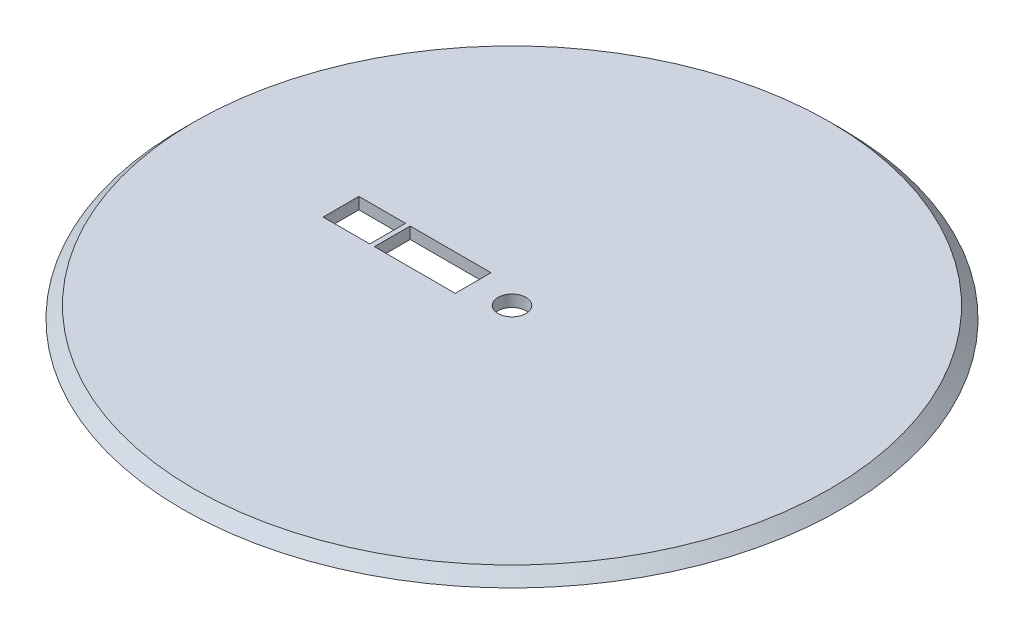
ISO-10303-21;
HEADER;
FILE_DESCRIPTION(('STEP AP214'),'2;1');
FILE_NAME('part.step','',(''),(''),'','','');
FILE_SCHEMA(('AUTOMOTIVE_DESIGN { 1 0 10303 214 1 1 1 1 }'));
ENDSEC;
DATA;
#1=APPLICATION_CONTEXT('core data for automotive mechanical design processes');
#2=APPLICATION_PROTOCOL_DEFINITION('international standard','automotive_design',2000,#1);
#3=PRODUCT_CONTEXT('',#1,'mechanical');
#4=PRODUCT('Part','Part','',(#3));
#5=PRODUCT_RELATED_PRODUCT_CATEGORY('part','',(#4));
#6=PRODUCT_DEFINITION_FORMATION('','',#4);
#7=PRODUCT_DEFINITION_CONTEXT('part definition',#1,'design');
#8=PRODUCT_DEFINITION('design','',#6,#7);
#9=PRODUCT_DEFINITION_SHAPE('','',#8);
#10=(LENGTH_UNIT() NAMED_UNIT(*) SI_UNIT(.MILLI.,.METRE.));
#11=(NAMED_UNIT(*) PLANE_ANGLE_UNIT() SI_UNIT($,.RADIAN.));
#12=(NAMED_UNIT(*) SI_UNIT($,.STERADIAN.) SOLID_ANGLE_UNIT());
#13=UNCERTAINTY_MEASURE_WITH_UNIT(LENGTH_MEASURE(1.E-05),#10,'distance_accuracy_value','');
#14=(GEOMETRIC_REPRESENTATION_CONTEXT(3) GLOBAL_UNCERTAINTY_ASSIGNED_CONTEXT((#13)) GLOBAL_UNIT_ASSIGNED_CONTEXT((#10,
#11,#12)) REPRESENTATION_CONTEXT('',''));
#15=CARTESIAN_POINT('',(0.,0.,0.));
#16=DIRECTION('',(0.,0.,1.));
#17=DIRECTION('',(1.,0.,0.));
#18=AXIS2_PLACEMENT_3D('',#15,#16,#17);
#19=CARTESIAN_POINT('',(-21.45,-0.375,0.));
#20=DIRECTION('',(0.,1.,0.));
#21=DIRECTION('',(0.,0.,1.));
#22=AXIS2_PLACEMENT_3D('',#19,#20,#21);
#23=PLANE('',#22);
#24=CARTESIAN_POINT('',(0.,-0.375,0.));
#25=DIRECTION('',(0.,1.,0.));
#26=DIRECTION('',(0.,0.,1.));
#27=AXIS2_PLACEMENT_3D('',#24,#25,#26);
#28=CIRCLE('',#27,21.2);
#29=CARTESIAN_POINT('',(0.,-0.375,21.2));
#30=VERTEX_POINT('',#29);
#31=EDGE_CURVE('E44',#30,#30,#28,.F.);
#32=ORIENTED_EDGE('',*,*,#31,.T.);
#33=EDGE_LOOP('',(#32));
#34=FACE_BOUND('',#33,.T.);
#35=CARTESIAN_POINT('',(0.,-0.375,0.));
#36=DIRECTION('',(0.,1.,0.));
#37=DIRECTION('',(0.,0.,1.));
#38=AXIS2_PLACEMENT_3D('',#35,#36,#37);
#39=CIRCLE('',#38,0.9);
#40=CARTESIAN_POINT('',(0.,-0.375,0.9));
#41=VERTEX_POINT('',#40);
#42=EDGE_CURVE('E220',#41,#41,#39,.T.);
#43=ORIENTED_EDGE('',*,*,#42,.T.);
#44=EDGE_LOOP('',(#43));
#45=FACE_BOUND('',#44,.T.);
#46=DIRECTION('',(1.,0.,0.));
#47=VECTOR('',#46,1.);
#48=CARTESIAN_POINT('',(-21.45,-0.375,1.15000000000001));
#49=LINE('',#48,#47);
#50=CARTESIAN_POINT('',(-7.7,-0.375,1.15));
#51=VERTEX_POINT('',#50);
#52=CARTESIAN_POINT('',(-2.5,-0.375,1.15));
#53=VERTEX_POINT('',#52);
#54=EDGE_CURVE('E214',#51,#53,#49,.T.);
#55=ORIENTED_EDGE('',*,*,#54,.T.);
#56=DIRECTION('',(0.,0.,-1.));
#57=VECTOR('',#56,1.);
#58=CARTESIAN_POINT('',(-2.5,-0.375,0.));
#59=LINE('',#58,#57);
#60=CARTESIAN_POINT('',(-2.5,-0.375,-1.15));
#61=VERTEX_POINT('',#60);
#62=EDGE_CURVE('E217',#53,#61,#59,.T.);
#63=ORIENTED_EDGE('',*,*,#62,.T.);
#64=DIRECTION('',(-1.,0.,0.));
#65=VECTOR('',#64,1.);
#66=CARTESIAN_POINT('',(-21.45,-0.375,-1.15));
#67=LINE('',#66,#65);
#68=CARTESIAN_POINT('',(-7.7,-0.375,-1.15));
#69=VERTEX_POINT('',#68);
#70=EDGE_CURVE('E211',#61,#69,#67,.T.);
#71=ORIENTED_EDGE('',*,*,#70,.T.);
#72=DIRECTION('',(0.,0.,1.));
#73=VECTOR('',#72,1.);
#74=CARTESIAN_POINT('',(-7.7,-0.375,0.));
#75=LINE('',#74,#73);
#76=EDGE_CURVE('E154',#69,#51,#75,.T.);
#77=ORIENTED_EDGE('',*,*,#76,.T.);
#78=EDGE_LOOP('',(#55,#63,#71,#77));
#79=FACE_BOUND('',#78,.T.);
#80=DIRECTION('',(1.,0.,0.));
#81=VECTOR('',#80,1.);
#82=CARTESIAN_POINT('',(-21.45,-0.375,1.15000000000001));
#83=LINE('',#82,#81);
#84=CARTESIAN_POINT('',(-11.,-0.375,1.15));
#85=VERTEX_POINT('',#84);
#86=CARTESIAN_POINT('',(-8.,-0.375,1.15));
#87=VERTEX_POINT('',#86);
#88=EDGE_CURVE('E205',#85,#87,#83,.T.);
#89=ORIENTED_EDGE('',*,*,#88,.T.);
#90=DIRECTION('',(0.,0.,-1.));
#91=VECTOR('',#90,1.);
#92=CARTESIAN_POINT('',(-8.,-0.375,0.));
#93=LINE('',#92,#91);
#94=CARTESIAN_POINT('',(-8.,-0.375,-1.15));
#95=VERTEX_POINT('',#94);
#96=EDGE_CURVE('E208',#87,#95,#93,.T.);
#97=ORIENTED_EDGE('',*,*,#96,.T.);
#98=DIRECTION('',(-1.,0.,0.));
#99=VECTOR('',#98,1.);
#100=CARTESIAN_POINT('',(-21.45,-0.375,-1.15));
#101=LINE('',#100,#99);
#102=CARTESIAN_POINT('',(-11.,-0.375,-1.15));
#103=VERTEX_POINT('',#102);
#104=EDGE_CURVE('E194',#95,#103,#101,.T.);
#105=ORIENTED_EDGE('',*,*,#104,.T.);
#106=DIRECTION('',(0.,0.,1.));
#107=VECTOR('',#106,1.);
#108=CARTESIAN_POINT('',(-11.,-0.375,0.));
#109=LINE('',#108,#107);
#110=EDGE_CURVE('E202',#103,#85,#109,.T.);
#111=ORIENTED_EDGE('',*,*,#110,.T.);
#112=EDGE_LOOP('',(#89,#97,#105,#111));
#113=FACE_BOUND('',#112,.T.);
#114=DIRECTION('',(-1.,0.,0.));
#115=VECTOR('',#114,1.);
#116=CARTESIAN_POINT('',(-2.1,-0.375,15.6));
#117=LINE('',#116,#115);
#118=CARTESIAN_POINT('',(2.1,-0.375,15.6));
#119=VERTEX_POINT('',#118);
#120=CARTESIAN_POINT('',(-2.1,-0.375,15.6));
#121=VERTEX_POINT('',#120);
#122=EDGE_CURVE('E256',#119,#121,#117,.T.);
#123=ORIENTED_EDGE('',*,*,#122,.F.);
#124=DIRECTION('',(0.,0.,1.));
#125=VECTOR('',#124,1.);
#126=CARTESIAN_POINT('',(2.1,-0.375,14.4));
#127=LINE('',#126,#125);
#128=CARTESIAN_POINT('',(2.1,-0.375,14.4));
#129=VERTEX_POINT('',#128);
#130=EDGE_CURVE('E261',#129,#119,#127,.T.);
#131=ORIENTED_EDGE('',*,*,#130,.F.);
#132=DIRECTION('',(1.,0.,0.));
#133=VECTOR('',#132,1.);
#134=CARTESIAN_POINT('',(-2.1,-0.375,14.4));
#135=LINE('',#134,#133);
#136=CARTESIAN_POINT('',(-2.1,-0.375,14.4));
#137=VERTEX_POINT('',#136);
#138=EDGE_CURVE('E273',#137,#129,#135,.T.);
#139=ORIENTED_EDGE('',*,*,#138,.F.);
#140=DIRECTION('',(0.,0.,-1.));
#141=VECTOR('',#140,1.);
#142=CARTESIAN_POINT('',(-2.1,-0.375,14.4));
#143=LINE('',#142,#141);
#144=EDGE_CURVE('E270',#121,#137,#143,.T.);
#145=ORIENTED_EDGE('',*,*,#144,.F.);
#146=EDGE_LOOP('',(#123,#131,#139,#145));
#147=FACE_BOUND('',#146,.T.);
#148=DIRECTION('',(-1.,0.,0.));
#149=VECTOR('',#148,1.);
#150=CARTESIAN_POINT('',(-2.1,-0.375,-14.4));
#151=LINE('',#150,#149);
#152=CARTESIAN_POINT('',(2.1,-0.375,-14.4));
#153=VERTEX_POINT('',#152);
#154=CARTESIAN_POINT('',(-2.09999999999999,-0.375,-14.4));
#155=VERTEX_POINT('',#154);
#156=EDGE_CURVE('E223',#153,#155,#151,.T.);
#157=ORIENTED_EDGE('',*,*,#156,.F.);
#158=DIRECTION('',(0.,0.,1.));
#159=VECTOR('',#158,1.);
#160=CARTESIAN_POINT('',(2.1,-0.375,-14.4));
#161=LINE('',#160,#159);
#162=CARTESIAN_POINT('',(2.1,-0.375,-15.6));
#163=VERTEX_POINT('',#162);
#164=EDGE_CURVE('E228',#163,#153,#161,.T.);
#165=ORIENTED_EDGE('',*,*,#164,.F.);
#166=DIRECTION('',(1.,0.,0.));
#167=VECTOR('',#166,1.);
#168=CARTESIAN_POINT('',(-2.1,-0.375,-15.6));
#169=LINE('',#168,#167);
#170=CARTESIAN_POINT('',(-2.1,-0.375,-15.6));
#171=VERTEX_POINT('',#170);
#172=EDGE_CURVE('E240',#171,#163,#169,.T.);
#173=ORIENTED_EDGE('',*,*,#172,.F.);
#174=DIRECTION('',(0.,0.,-1.));
#175=VECTOR('',#174,1.);
#176=CARTESIAN_POINT('',(-2.1,-0.375,-14.4));
#177=LINE('',#176,#175);
#178=EDGE_CURVE('E237',#155,#171,#177,.T.);
#179=ORIENTED_EDGE('',*,*,#178,.F.);
#180=EDGE_LOOP('',(#157,#165,#173,#179));
#181=FACE_BOUND('',#180,.T.);
#182=ADVANCED_FACE('F36',(#34,#45,#79,#113,#147,#181),#23,.F.);
#183=CARTESIAN_POINT('',(-21.45,0.375,0.));
#184=DIRECTION('',(0.,-1.,0.));
#185=DIRECTION('',(0.,0.,-1.));
#186=AXIS2_PLACEMENT_3D('',#183,#184,#185);
#187=PLANE('',#186);
#188=CARTESIAN_POINT('',(0.,0.375,0.));
#189=DIRECTION('',(0.,-1.,0.));
#190=DIRECTION('',(0.,0.,-1.));
#191=AXIS2_PLACEMENT_3D('',#188,#189,#190);
#192=CIRCLE('',#191,20.45);
#193=CARTESIAN_POINT('',(0.,0.375,-20.45));
#194=VERTEX_POINT('',#193);
#195=EDGE_CURVE('E12',#194,#194,#192,.F.);
#196=ORIENTED_EDGE('',*,*,#195,.T.);
#197=EDGE_LOOP('',(#196));
#198=FACE_BOUND('',#197,.T.);
#199=CARTESIAN_POINT('',(0.,0.375,0.));
#200=DIRECTION('',(0.,1.,0.));
#201=DIRECTION('',(0.,0.,1.));
#202=AXIS2_PLACEMENT_3D('',#199,#200,#201);
#203=CIRCLE('',#202,0.9);
#204=CARTESIAN_POINT('',(0.,0.375,0.9));
#205=VERTEX_POINT('',#204);
#206=EDGE_CURVE('E178',#205,#205,#203,.T.);
#207=ORIENTED_EDGE('',*,*,#206,.F.);
#208=EDGE_LOOP('',(#207));
#209=FACE_BOUND('',#208,.T.);
#210=DIRECTION('',(-1.,0.,0.));
#211=VECTOR('',#210,1.);
#212=CARTESIAN_POINT('',(-7.7,0.375,-1.15));
#213=LINE('',#212,#211);
#214=CARTESIAN_POINT('',(-2.5,0.375,-1.15));
#215=VERTEX_POINT('',#214);
#216=CARTESIAN_POINT('',(-7.7,0.375,-1.15));
#217=VERTEX_POINT('',#216);
#218=EDGE_CURVE('E161',#215,#217,#213,.T.);
#219=ORIENTED_EDGE('',*,*,#218,.F.);
#220=DIRECTION('',(0.,0.,-1.));
#221=VECTOR('',#220,1.);
#222=CARTESIAN_POINT('',(-2.5,0.375,-1.15));
#223=LINE('',#222,#221);
#224=CARTESIAN_POINT('',(-2.5,0.375,1.15));
#225=VERTEX_POINT('',#224);
#226=EDGE_CURVE('E166',#225,#215,#223,.T.);
#227=ORIENTED_EDGE('',*,*,#226,.F.);
#228=DIRECTION('',(1.,0.,0.));
#229=VECTOR('',#228,1.);
#230=CARTESIAN_POINT('',(-7.7,0.375,1.15));
#231=LINE('',#230,#229);
#232=CARTESIAN_POINT('',(-7.7,0.375,1.15));
#233=VERTEX_POINT('',#232);
#234=EDGE_CURVE('E171',#233,#225,#231,.T.);
#235=ORIENTED_EDGE('',*,*,#234,.F.);
#236=DIRECTION('',(0.,0.,1.));
#237=VECTOR('',#236,1.);
#238=CARTESIAN_POINT('',(-7.7,0.375,-1.15));
#239=LINE('',#238,#237);
#240=EDGE_CURVE('E151',#217,#233,#239,.T.);
#241=ORIENTED_EDGE('',*,*,#240,.F.);
#242=EDGE_LOOP('',(#219,#227,#235,#241));
#243=FACE_BOUND('',#242,.T.);
#244=DIRECTION('',(-1.,0.,0.));
#245=VECTOR('',#244,1.);
#246=CARTESIAN_POINT('',(-11.,0.375,-1.15));
#247=LINE('',#246,#245);
#248=CARTESIAN_POINT('',(-8.,0.375,-1.15));
#249=VERTEX_POINT('',#248);
#250=CARTESIAN_POINT('',(-11.,0.375,-1.15));
#251=VERTEX_POINT('',#250);
#252=EDGE_CURVE('E183',#249,#251,#247,.T.);
#253=ORIENTED_EDGE('',*,*,#252,.F.);
#254=DIRECTION('',(0.,0.,-1.));
#255=VECTOR('',#254,1.);
#256=CARTESIAN_POINT('',(-8.,0.375,-1.15));
#257=LINE('',#256,#255);
#258=CARTESIAN_POINT('',(-8.,0.375,1.15));
#259=VERTEX_POINT('',#258);
#260=EDGE_CURVE('E181',#259,#249,#257,.T.);
#261=ORIENTED_EDGE('',*,*,#260,.F.);
#262=DIRECTION('',(1.,0.,0.));
#263=VECTOR('',#262,1.);
#264=CARTESIAN_POINT('',(-11.,0.375,1.15));
#265=LINE('',#264,#263);
#266=CARTESIAN_POINT('',(-11.,0.375,1.15));
#267=VERTEX_POINT('',#266);
#268=EDGE_CURVE('E188',#267,#259,#265,.T.);
#269=ORIENTED_EDGE('',*,*,#268,.F.);
#270=DIRECTION('',(0.,0.,1.));
#271=VECTOR('',#270,1.);
#272=CARTESIAN_POINT('',(-11.,0.375,-1.15));
#273=LINE('',#272,#271);
#274=EDGE_CURVE('E185',#251,#267,#273,.T.);
#275=ORIENTED_EDGE('',*,*,#274,.F.);
#276=EDGE_LOOP('',(#253,#261,#269,#275));
#277=FACE_BOUND('',#276,.T.);
#278=ADVANCED_FACE('F168',(#198,#209,#243,#277),#187,.F.);
#279=CARTESIAN_POINT('',(-2.1,-2.175,15.6));
#280=DIRECTION('',(0.,0.,-1.));
#281=DIRECTION('',(-1.,0.,0.));
#282=AXIS2_PLACEMENT_3D('',#279,#280,#281);
#283=PLANE('',#282);
#284=ORIENTED_EDGE('',*,*,#122,.T.);
#285=DIRECTION('',(0.,1.,0.));
#286=VECTOR('',#285,1.);
#287=CARTESIAN_POINT('',(-2.1,-2.175,15.6));
#288=LINE('',#287,#286);
#289=CARTESIAN_POINT('',(-2.1,-2.175,15.6));
#290=VERTEX_POINT('',#289);
#291=EDGE_CURVE('E286',#290,#121,#288,.T.);
#292=ORIENTED_EDGE('',*,*,#291,.F.);
#293=DIRECTION('',(-1.,0.,0.));
#294=VECTOR('',#293,1.);
#295=CARTESIAN_POINT('',(-2.1,-2.175,15.6));
#296=LINE('',#295,#294);
#297=CARTESIAN_POINT('',(2.1,-2.175,15.6));
#298=VERTEX_POINT('',#297);
#299=EDGE_CURVE('E257',#298,#290,#296,.T.);
#300=ORIENTED_EDGE('',*,*,#299,.F.);
#301=DIRECTION('',(0.,1.,0.));
#302=VECTOR('',#301,1.);
#303=CARTESIAN_POINT('',(2.1,-2.175,15.6));
#304=LINE('',#303,#302);
#305=EDGE_CURVE('E267',#298,#119,#304,.T.);
#306=ORIENTED_EDGE('',*,*,#305,.T.);
#307=EDGE_LOOP('',(#284,#292,#300,#306));
#308=FACE_BOUND('',#307,.T.);
#309=ADVANCED_FACE('F306',(#308),#283,.F.);
#310=CARTESIAN_POINT('',(-2.1,-2.175,14.4));
#311=DIRECTION('',(1.,0.,0.));
#312=DIRECTION('',(0.,0.,-1.));
#313=AXIS2_PLACEMENT_3D('',#310,#311,#312);
#314=PLANE('',#313);
#315=ORIENTED_EDGE('',*,*,#144,.T.);
#316=DIRECTION('',(0.,1.,0.));
#317=VECTOR('',#316,1.);
#318=CARTESIAN_POINT('',(-2.1,-2.175,14.4));
#319=LINE('',#318,#317);
#320=CARTESIAN_POINT('',(-2.1,-2.175,14.4));
#321=VERTEX_POINT('',#320);
#322=EDGE_CURVE('E283',#321,#137,#319,.T.);
#323=ORIENTED_EDGE('',*,*,#322,.F.);
#324=DIRECTION('',(0.,0.,-1.));
#325=VECTOR('',#324,1.);
#326=CARTESIAN_POINT('',(-2.1,-2.175,14.4));
#327=LINE('',#326,#325);
#328=EDGE_CURVE('E260',#290,#321,#327,.T.);
#329=ORIENTED_EDGE('',*,*,#328,.F.);
#330=ORIENTED_EDGE('',*,*,#291,.T.);
#331=EDGE_LOOP('',(#315,#323,#329,#330));
#332=FACE_BOUND('',#331,.T.);
#333=ADVANCED_FACE('F312',(#332),#314,.F.);
#334=CARTESIAN_POINT('',(-2.1,-2.175,14.4));
#335=DIRECTION('',(0.,0.,1.));
#336=DIRECTION('',(1.,0.,0.));
#337=AXIS2_PLACEMENT_3D('',#334,#335,#336);
#338=PLANE('',#337);
#339=ORIENTED_EDGE('',*,*,#138,.T.);
#340=DIRECTION('',(0.,1.,0.));
#341=VECTOR('',#340,1.);
#342=CARTESIAN_POINT('',(2.1,-2.175,14.4));
#343=LINE('',#342,#341);
#344=CARTESIAN_POINT('',(2.1,-2.175,14.4));
#345=VERTEX_POINT('',#344);
#346=EDGE_CURVE('E280',#345,#129,#343,.T.);
#347=ORIENTED_EDGE('',*,*,#346,.F.);
#348=DIRECTION('',(1.,0.,0.));
#349=VECTOR('',#348,1.);
#350=CARTESIAN_POINT('',(-2.1,-2.175,14.4));
#351=LINE('',#350,#349);
#352=EDGE_CURVE('E263',#321,#345,#351,.T.);
#353=ORIENTED_EDGE('',*,*,#352,.F.);
#354=ORIENTED_EDGE('',*,*,#322,.T.);
#355=EDGE_LOOP('',(#339,#347,#353,#354));
#356=FACE_BOUND('',#355,.T.);
#357=ADVANCED_FACE('F316',(#356),#338,.F.);
#358=CARTESIAN_POINT('',(2.1,-2.175,14.4));
#359=DIRECTION('',(-1.,0.,0.));
#360=DIRECTION('',(0.,0.,1.));
#361=AXIS2_PLACEMENT_3D('',#358,#359,#360);
#362=PLANE('',#361);
#363=ORIENTED_EDGE('',*,*,#130,.T.);
#364=ORIENTED_EDGE('',*,*,#305,.F.);
#365=DIRECTION('',(0.,0.,1.));
#366=VECTOR('',#365,1.);
#367=CARTESIAN_POINT('',(2.1,-2.175,14.4));
#368=LINE('',#367,#366);
#369=EDGE_CURVE('E265',#345,#298,#368,.T.);
#370=ORIENTED_EDGE('',*,*,#369,.F.);
#371=ORIENTED_EDGE('',*,*,#346,.T.);
#372=EDGE_LOOP('',(#363,#364,#370,#371));
#373=FACE_BOUND('',#372,.T.);
#374=ADVANCED_FACE('F320',(#373),#362,.F.);
#375=CARTESIAN_POINT('',(0.,-2.175,0.));
#376=DIRECTION('',(0.,-1.,0.));
#377=DIRECTION('',(0.,0.,-1.));
#378=AXIS2_PLACEMENT_3D('',#375,#376,#377);
#379=PLANE('',#378);
#380=ORIENTED_EDGE('',*,*,#299,.T.);
#381=ORIENTED_EDGE('',*,*,#328,.T.);
#382=ORIENTED_EDGE('',*,*,#352,.T.);
#383=ORIENTED_EDGE('',*,*,#369,.T.);
#384=EDGE_LOOP('',(#380,#381,#382,#383));
#385=FACE_BOUND('',#384,.T.);
#386=ADVANCED_FACE('F324',(#385),#379,.T.);
#387=CARTESIAN_POINT('',(-2.1,-2.175,-14.4));
#388=DIRECTION('',(0.,0.,-1.));
#389=DIRECTION('',(-1.,0.,0.));
#390=AXIS2_PLACEMENT_3D('',#387,#388,#389);
#391=PLANE('',#390);
#392=ORIENTED_EDGE('',*,*,#156,.T.);
#393=DIRECTION('',(0.,1.,0.));
#394=VECTOR('',#393,1.);
#395=CARTESIAN_POINT('',(-2.1,-2.175,-14.4));
#396=LINE('',#395,#394);
#397=CARTESIAN_POINT('',(-2.1,-2.175,-14.4));
#398=VERTEX_POINT('',#397);
#399=EDGE_CURVE('E253',#398,#155,#396,.T.);
#400=ORIENTED_EDGE('',*,*,#399,.F.);
#401=DIRECTION('',(-1.,0.,0.));
#402=VECTOR('',#401,1.);
#403=CARTESIAN_POINT('',(-2.1,-2.175,-14.4));
#404=LINE('',#403,#402);
#405=CARTESIAN_POINT('',(2.1,-2.175,-14.4));
#406=VERTEX_POINT('',#405);
#407=EDGE_CURVE('E224',#406,#398,#404,.T.);
#408=ORIENTED_EDGE('',*,*,#407,.F.);
#409=DIRECTION('',(0.,1.,0.));
#410=VECTOR('',#409,1.);
#411=CARTESIAN_POINT('',(2.1,-2.175,-14.4));
#412=LINE('',#411,#410);
#413=EDGE_CURVE('E234',#406,#153,#412,.T.);
#414=ORIENTED_EDGE('',*,*,#413,.T.);
#415=EDGE_LOOP('',(#392,#400,#408,#414));
#416=FACE_BOUND('',#415,.T.);
#417=ADVANCED_FACE('F328',(#416),#391,.F.);
#418=CARTESIAN_POINT('',(-2.1,-2.175,-14.4));
#419=DIRECTION('',(1.,0.,0.));
#420=DIRECTION('',(0.,0.,-1.));
#421=AXIS2_PLACEMENT_3D('',#418,#419,#420);
#422=PLANE('',#421);
#423=ORIENTED_EDGE('',*,*,#178,.T.);
#424=DIRECTION('',(0.,1.,0.));
#425=VECTOR('',#424,1.);
#426=CARTESIAN_POINT('',(-2.1,-2.175,-15.6));
#427=LINE('',#426,#425);
#428=CARTESIAN_POINT('',(-2.1,-2.175,-15.6));
#429=VERTEX_POINT('',#428);
#430=EDGE_CURVE('E250',#429,#171,#427,.T.);
#431=ORIENTED_EDGE('',*,*,#430,.F.);
#432=DIRECTION('',(0.,0.,-1.));
#433=VECTOR('',#432,1.);
#434=CARTESIAN_POINT('',(-2.1,-2.175,-14.4));
#435=LINE('',#434,#433);
#436=EDGE_CURVE('E227',#398,#429,#435,.T.);
#437=ORIENTED_EDGE('',*,*,#436,.F.);
#438=ORIENTED_EDGE('',*,*,#399,.T.);
#439=EDGE_LOOP('',(#423,#431,#437,#438));
#440=FACE_BOUND('',#439,.T.);
#441=ADVANCED_FACE('F332',(#440),#422,.F.);
#442=CARTESIAN_POINT('',(-2.1,-2.175,-15.6));
#443=DIRECTION('',(0.,0.,1.));
#444=DIRECTION('',(1.,0.,0.));
#445=AXIS2_PLACEMENT_3D('',#442,#443,#444);
#446=PLANE('',#445);
#447=ORIENTED_EDGE('',*,*,#172,.T.);
#448=DIRECTION('',(0.,1.,0.));
#449=VECTOR('',#448,1.);
#450=CARTESIAN_POINT('',(2.1,-2.175,-15.6));
#451=LINE('',#450,#449);
#452=CARTESIAN_POINT('',(2.1,-2.175,-15.6));
#453=VERTEX_POINT('',#452);
#454=EDGE_CURVE('E247',#453,#163,#451,.T.);
#455=ORIENTED_EDGE('',*,*,#454,.F.);
#456=DIRECTION('',(1.,0.,0.));
#457=VECTOR('',#456,1.);
#458=CARTESIAN_POINT('',(-2.1,-2.175,-15.6));
#459=LINE('',#458,#457);
#460=EDGE_CURVE('E230',#429,#453,#459,.T.);
#461=ORIENTED_EDGE('',*,*,#460,.F.);
#462=ORIENTED_EDGE('',*,*,#430,.T.);
#463=EDGE_LOOP('',(#447,#455,#461,#462));
#464=FACE_BOUND('',#463,.T.);
#465=ADVANCED_FACE('F336',(#464),#446,.F.);
#466=CARTESIAN_POINT('',(2.1,-2.175,-14.4));
#467=DIRECTION('',(-1.,0.,0.));
#468=DIRECTION('',(0.,0.,1.));
#469=AXIS2_PLACEMENT_3D('',#466,#467,#468);
#470=PLANE('',#469);
#471=ORIENTED_EDGE('',*,*,#164,.T.);
#472=ORIENTED_EDGE('',*,*,#413,.F.);
#473=DIRECTION('',(0.,0.,1.));
#474=VECTOR('',#473,1.);
#475=CARTESIAN_POINT('',(2.1,-2.175,-14.4));
#476=LINE('',#475,#474);
#477=EDGE_CURVE('E232',#453,#406,#476,.T.);
#478=ORIENTED_EDGE('',*,*,#477,.F.);
#479=ORIENTED_EDGE('',*,*,#454,.T.);
#480=EDGE_LOOP('',(#471,#472,#478,#479));
#481=FACE_BOUND('',#480,.T.);
#482=ADVANCED_FACE('F340',(#481),#470,.F.);
#483=CARTESIAN_POINT('',(0.,-2.175,0.));
#484=DIRECTION('',(0.,1.,0.));
#485=DIRECTION('',(0.,0.,1.));
#486=AXIS2_PLACEMENT_3D('',#483,#484,#485);
#487=PLANE('',#486);
#488=ORIENTED_EDGE('',*,*,#407,.T.);
#489=ORIENTED_EDGE('',*,*,#436,.T.);
#490=ORIENTED_EDGE('',*,*,#460,.T.);
#491=ORIENTED_EDGE('',*,*,#477,.T.);
#492=EDGE_LOOP('',(#488,#489,#490,#491));
#493=FACE_BOUND('',#492,.T.);
#494=ADVANCED_FACE('F344',(#493),#487,.F.);
#495=CARTESIAN_POINT('',(-8.,-2.175,-1.15));
#496=DIRECTION('',(1.,0.,0.));
#497=DIRECTION('',(0.,0.,-1.));
#498=AXIS2_PLACEMENT_3D('',#495,#496,#497);
#499=PLANE('',#498);
#500=DIRECTION('',(0.,1.,0.));
#501=VECTOR('',#500,1.);
#502=CARTESIAN_POINT('',(-8.,-2.175,1.15));
#503=LINE('',#502,#501);
#504=EDGE_CURVE('E192',#87,#259,#503,.T.);
#505=ORIENTED_EDGE('',*,*,#504,.T.);
#506=ORIENTED_EDGE('',*,*,#260,.T.);
#507=DIRECTION('',(0.,1.,0.));
#508=VECTOR('',#507,1.);
#509=CARTESIAN_POINT('',(-8.,-2.175,-1.15));
#510=LINE('',#509,#508);
#511=EDGE_CURVE('E191',#95,#249,#510,.T.);
#512=ORIENTED_EDGE('',*,*,#511,.F.);
#513=ORIENTED_EDGE('',*,*,#96,.F.);
#514=EDGE_LOOP('',(#505,#506,#512,#513));
#515=FACE_BOUND('',#514,.T.);
#516=ADVANCED_FACE('F348',(#515),#499,.F.);
#517=CARTESIAN_POINT('',(-11.,-2.175,1.15));
#518=DIRECTION('',(0.,0.,1.));
#519=DIRECTION('',(1.,0.,0.));
#520=AXIS2_PLACEMENT_3D('',#517,#518,#519);
#521=PLANE('',#520);
#522=DIRECTION('',(0.,1.,0.));
#523=VECTOR('',#522,1.);
#524=CARTESIAN_POINT('',(-11.,-2.175,1.15));
#525=LINE('',#524,#523);
#526=EDGE_CURVE('E195',#85,#267,#525,.T.);
#527=ORIENTED_EDGE('',*,*,#526,.T.);
#528=ORIENTED_EDGE('',*,*,#268,.T.);
#529=ORIENTED_EDGE('',*,*,#504,.F.);
#530=ORIENTED_EDGE('',*,*,#88,.F.);
#531=EDGE_LOOP('',(#527,#528,#529,#530));
#532=FACE_BOUND('',#531,.T.);
#533=ADVANCED_FACE('F352',(#532),#521,.F.);
#534=CARTESIAN_POINT('',(-11.,-2.175,-1.15));
#535=DIRECTION('',(-1.,0.,0.));
#536=DIRECTION('',(0.,0.,1.));
#537=AXIS2_PLACEMENT_3D('',#534,#535,#536);
#538=PLANE('',#537);
#539=DIRECTION('',(0.,1.,0.));
#540=VECTOR('',#539,1.);
#541=CARTESIAN_POINT('',(-11.,-2.175,-1.15));
#542=LINE('',#541,#540);
#543=EDGE_CURVE('E59',#103,#251,#542,.T.);
#544=ORIENTED_EDGE('',*,*,#543,.T.);
#545=ORIENTED_EDGE('',*,*,#274,.T.);
#546=ORIENTED_EDGE('',*,*,#526,.F.);
#547=ORIENTED_EDGE('',*,*,#110,.F.);
#548=EDGE_LOOP('',(#544,#545,#546,#547));
#549=FACE_BOUND('',#548,.T.);
#550=ADVANCED_FACE('F358',(#549),#538,.F.);
#551=CARTESIAN_POINT('',(-11.,-2.175,-1.15));
#552=DIRECTION('',(0.,0.,-1.));
#553=DIRECTION('',(-1.,0.,0.));
#554=AXIS2_PLACEMENT_3D('',#551,#552,#553);
#555=PLANE('',#554);
#556=ORIENTED_EDGE('',*,*,#511,.T.);
#557=ORIENTED_EDGE('',*,*,#252,.T.);
#558=ORIENTED_EDGE('',*,*,#543,.F.);
#559=ORIENTED_EDGE('',*,*,#104,.F.);
#560=EDGE_LOOP('',(#556,#557,#558,#559));
#561=FACE_BOUND('',#560,.T.);
#562=ADVANCED_FACE('F354',(#561),#555,.F.);
#563=CARTESIAN_POINT('',(-2.5,-2.175,-1.15));
#564=DIRECTION('',(1.,0.,0.));
#565=DIRECTION('',(0.,0.,-1.));
#566=AXIS2_PLACEMENT_3D('',#563,#564,#565);
#567=PLANE('',#566);
#568=DIRECTION('',(0.,1.,0.));
#569=VECTOR('',#568,1.);
#570=CARTESIAN_POINT('',(-2.5,-2.175,1.15));
#571=LINE('',#570,#569);
#572=EDGE_CURVE('E176',#53,#225,#571,.T.);
#573=ORIENTED_EDGE('',*,*,#572,.T.);
#574=ORIENTED_EDGE('',*,*,#226,.T.);
#575=DIRECTION('',(0.,1.,0.));
#576=VECTOR('',#575,1.);
#577=CARTESIAN_POINT('',(-2.5,-2.175,-1.15));
#578=LINE('',#577,#576);
#579=EDGE_CURVE('E157',#61,#215,#578,.T.);
#580=ORIENTED_EDGE('',*,*,#579,.F.);
#581=ORIENTED_EDGE('',*,*,#62,.F.);
#582=EDGE_LOOP('',(#573,#574,#580,#581));
#583=FACE_BOUND('',#582,.T.);
#584=ADVANCED_FACE('F357',(#583),#567,.F.);
#585=CARTESIAN_POINT('',(-7.7,-2.175,1.15));
#586=DIRECTION('',(0.,0.,1.));
#587=DIRECTION('',(1.,0.,0.));
#588=AXIS2_PLACEMENT_3D('',#585,#586,#587);
#589=PLANE('',#588);
#590=DIRECTION('',(0.,1.,0.));
#591=VECTOR('',#590,1.);
#592=CARTESIAN_POINT('',(-7.7,-2.175,1.15));
#593=LINE('',#592,#591);
#594=EDGE_CURVE('E156',#51,#233,#593,.T.);
#595=ORIENTED_EDGE('',*,*,#594,.T.);
#596=ORIENTED_EDGE('',*,*,#234,.T.);
#597=ORIENTED_EDGE('',*,*,#572,.F.);
#598=ORIENTED_EDGE('',*,*,#54,.F.);
#599=EDGE_LOOP('',(#595,#596,#597,#598));
#600=FACE_BOUND('',#599,.T.);
#601=ADVANCED_FACE('F367',(#600),#589,.F.);
#602=CARTESIAN_POINT('',(-7.7,-2.175,-1.15));
#603=DIRECTION('',(-1.,0.,0.));
#604=DIRECTION('',(0.,0.,1.));
#605=AXIS2_PLACEMENT_3D('',#602,#603,#604);
#606=PLANE('',#605);
#607=DIRECTION('',(0.,1.,0.));
#608=VECTOR('',#607,1.);
#609=CARTESIAN_POINT('',(-7.7,-2.175,-1.15));
#610=LINE('',#609,#608);
#611=EDGE_CURVE('E51',#69,#217,#610,.T.);
#612=ORIENTED_EDGE('',*,*,#611,.T.);
#613=ORIENTED_EDGE('',*,*,#240,.T.);
#614=ORIENTED_EDGE('',*,*,#594,.F.);
#615=ORIENTED_EDGE('',*,*,#76,.F.);
#616=EDGE_LOOP('',(#612,#613,#614,#615));
#617=FACE_BOUND('',#616,.T.);
#618=ADVANCED_FACE('F148',(#617),#606,.F.);
#619=CARTESIAN_POINT('',(-7.7,-2.175,-1.15));
#620=DIRECTION('',(0.,0.,-1.));
#621=DIRECTION('',(-1.,0.,0.));
#622=AXIS2_PLACEMENT_3D('',#619,#620,#621);
#623=PLANE('',#622);
#624=ORIENTED_EDGE('',*,*,#579,.T.);
#625=ORIENTED_EDGE('',*,*,#218,.T.);
#626=ORIENTED_EDGE('',*,*,#611,.F.);
#627=ORIENTED_EDGE('',*,*,#70,.F.);
#628=EDGE_LOOP('',(#624,#625,#626,#627));
#629=FACE_BOUND('',#628,.T.);
#630=ADVANCED_FACE('F162',(#629),#623,.F.);
#631=CARTESIAN_POINT('',(0.,-2.175,0.));
#632=DIRECTION('',(0.,1.,0.));
#633=DIRECTION('',(0.,0.,1.));
#634=AXIS2_PLACEMENT_3D('',#631,#632,#633);
#635=CYLINDRICAL_SURFACE('',#634,0.9);
#636=ORIENTED_EDGE('',*,*,#206,.T.);
#637=EDGE_LOOP('',(#636));
#638=FACE_BOUND('',#637,.T.);
#639=ORIENTED_EDGE('',*,*,#42,.F.);
#640=EDGE_LOOP('',(#639));
#641=FACE_BOUND('',#640,.T.);
#642=ADVANCED_FACE('F294',(#638,#641),#635,.F.);
#643=CARTESIAN_POINT('',(0.,-0.625000000000018,0.));
#644=DIRECTION('',(0.,-1.,0.));
#645=DIRECTION('',(0.,0.,-1.));
#646=AXIS2_PLACEMENT_3D('',#643,#644,#645);
#647=CONICAL_SURFACE('',#646,21.45,0.785398163397443);
#648=ORIENTED_EDGE('',*,*,#195,.F.);
#649=EDGE_LOOP('',(#648));
#650=FACE_BOUND('',#649,.T.);
#651=ORIENTED_EDGE('',*,*,#31,.F.);
#652=EDGE_LOOP('',(#651));
#653=FACE_BOUND('',#652,.T.);
#654=ADVANCED_FACE('F38',(#650,#653),#647,.T.);
#655=CLOSED_SHELL('',(#182,#278,#309,#333,#357,#374,#386,#417,#441,#465,#482,#494,#516,#533,
#550,#562,#584,#601,#618,#630,#642,#654));
#656=MANIFOLD_SOLID_BREP('B2',#655);
#657=ADVANCED_BREP_SHAPE_REPRESENTATION('',(#18,#656),#14);
#658=SHAPE_DEFINITION_REPRESENTATION(#9,#657);
ENDSEC;
END-ISO-10303-21;
